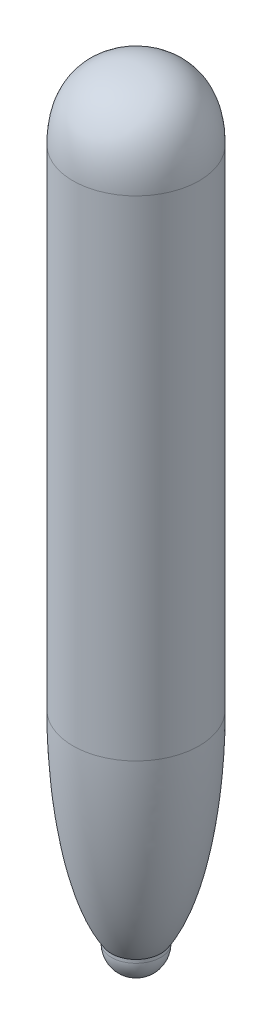
ISO-10303-21;
HEADER;
FILE_DESCRIPTION(('STEP AP214'),'2;1');
FILE_NAME('part.step','',(''),(''),'','','');
FILE_SCHEMA(('AUTOMOTIVE_DESIGN { 1 0 10303 214 1 1 1 1 }'));
ENDSEC;
DATA;
#1=APPLICATION_CONTEXT('core data for automotive mechanical design processes');
#2=APPLICATION_PROTOCOL_DEFINITION('international standard','automotive_design',2000,#1);
#3=PRODUCT_CONTEXT('',#1,'mechanical');
#4=PRODUCT('Part','Part','',(#3));
#5=PRODUCT_RELATED_PRODUCT_CATEGORY('part','',(#4));
#6=PRODUCT_DEFINITION_FORMATION('','',#4);
#7=PRODUCT_DEFINITION_CONTEXT('part definition',#1,'design');
#8=PRODUCT_DEFINITION('design','',#6,#7);
#9=PRODUCT_DEFINITION_SHAPE('','',#8);
#10=(LENGTH_UNIT() NAMED_UNIT(*) SI_UNIT(.MILLI.,.METRE.));
#11=(NAMED_UNIT(*) PLANE_ANGLE_UNIT() SI_UNIT($,.RADIAN.));
#12=(NAMED_UNIT(*) SI_UNIT($,.STERADIAN.) SOLID_ANGLE_UNIT());
#13=UNCERTAINTY_MEASURE_WITH_UNIT(LENGTH_MEASURE(1.E-05),#10,'distance_accuracy_value','');
#14=(GEOMETRIC_REPRESENTATION_CONTEXT(3) GLOBAL_UNCERTAINTY_ASSIGNED_CONTEXT((#13)) GLOBAL_UNIT_ASSIGNED_CONTEXT((#10,
#11,#12)) REPRESENTATION_CONTEXT('',''));
#15=CARTESIAN_POINT('',(0.,0.,0.));
#16=DIRECTION('',(0.,0.,1.));
#17=DIRECTION('',(1.,0.,0.));
#18=AXIS2_PLACEMENT_3D('',#15,#16,#17);
#19=CARTESIAN_POINT('',(0.,0.,0.));
#20=CARTESIAN_POINT('',(139.549394705016,33.9263469496858,0.));
#21=CARTESIAN_POINT('',(203.2,396.111416325188,0.));
#22=CARTESIAN_POINT('',(203.2,704.706637655799,0.));
#23=B_SPLINE_CURVE_WITH_KNOTS('',3,(#19,#20,#21,#22),.UNSPECIFIED.,.F.,.F.,(4,4),(0.,1.),.UNSPECIFIED.);
#24=CARTESIAN_POINT('',(0.,0.,0.));
#25=DIRECTION('',(0.,-1.,0.));
#26=AXIS1_PLACEMENT('',#24,#25);
#27=SURFACE_OF_REVOLUTION('',#23,#26);
#28=CARTESIAN_POINT('',(0.,704.706637655799,0.));
#29=DIRECTION('',(0.,-1.,0.));
#30=DIRECTION('',(0.,0.,-1.));
#31=AXIS2_PLACEMENT_3D('',#28,#29,#30);
#32=CIRCLE('',#31,203.2);
#33=CARTESIAN_POINT('',(0.,704.706637655799,-203.2));
#34=VERTEX_POINT('',#33);
#35=EDGE_CURVE('E58',#34,#34,#32,.T.);
#36=ORIENTED_EDGE('',*,*,#35,.T.);
#37=EDGE_LOOP('',(#36));
#38=FACE_BOUND('',#37,.T.);
#39=CARTESIAN_POINT('',(0.,63.84200074123,0.));
#40=DIRECTION('',(0.,-1.,0.));
#41=DIRECTION('',(0.,0.,-1.));
#42=AXIS2_PLACEMENT_3D('',#39,#40,#41);
#43=CIRCLE('',#42,79.7648455991294);
#44=CARTESIAN_POINT('',(0.,63.84200074123,-79.7648455991294));
#45=VERTEX_POINT('',#44);
#46=EDGE_CURVE('E53',#45,#45,#43,.F.);
#47=ORIENTED_EDGE('',*,*,#46,.T.);
#48=EDGE_LOOP('',(#47));
#49=FACE_BOUND('',#48,.T.);
#50=ADVANCED_FACE('F49',(#38,#49),#27,.F.);
#51=CARTESIAN_POINT('',(203.2,2280.69562717559,0.));
#52=CARTESIAN_POINT('',(203.2,2426.17399588945,0.));
#53=CARTESIAN_POINT('',(127.337237947954,2501.9,0.));
#54=CARTESIAN_POINT('',(0.,2501.9,0.));
#55=B_SPLINE_CURVE_WITH_KNOTS('',3,(#51,#52,#53,#54),.UNSPECIFIED.,.F.,.F.,(4,4),(0.,1.),.UNSPECIFIED.);
#56=CARTESIAN_POINT('',(0.,0.,0.));
#57=DIRECTION('',(0.,-1.,0.));
#58=AXIS1_PLACEMENT('',#56,#57);
#59=SURFACE_OF_REVOLUTION('',#55,#58);
#60=CARTESIAN_POINT('',(0.,2501.9,0.));
#61=VERTEX_POINT('',#60);
#62=VERTEX_LOOP('',#61);
#63=FACE_BOUND('',#62,.T.);
#64=CARTESIAN_POINT('',(0.,2280.69562717559,0.));
#65=DIRECTION('',(0.,-1.,0.));
#66=DIRECTION('',(0.,0.,-1.));
#67=AXIS2_PLACEMENT_3D('',#64,#65,#66);
#68=CIRCLE('',#67,203.2);
#69=CARTESIAN_POINT('',(0.,2280.69562717559,-203.2));
#70=VERTEX_POINT('',#69);
#71=EDGE_CURVE('E11',#70,#70,#68,.T.);
#72=ORIENTED_EDGE('',*,*,#71,.F.);
#73=EDGE_LOOP('',(#72));
#74=FACE_BOUND('',#73,.T.);
#75=ADVANCED_FACE('F61',(#63,#74),#59,.F.);
#76=CARTESIAN_POINT('',(0.,0.,0.));
#77=DIRECTION('',(0.,-1.,0.));
#78=DIRECTION('',(0.,0.,-1.));
#79=AXIS2_PLACEMENT_3D('',#76,#77,#78);
#80=CYLINDRICAL_SURFACE('',#79,203.2);
#81=ORIENTED_EDGE('',*,*,#71,.T.);
#82=EDGE_LOOP('',(#81));
#83=FACE_BOUND('',#82,.T.);
#84=ORIENTED_EDGE('',*,*,#35,.F.);
#85=EDGE_LOOP('',(#84));
#86=FACE_BOUND('',#85,.T.);
#87=ADVANCED_FACE('F64',(#83,#86),#80,.T.);
#88=CARTESIAN_POINT('',(0.,53.1719436019982,0.));
#89=DIRECTION('',(0.,1.,0.));
#90=DIRECTION('',(-1.,0.,0.));
#91=AXIS2_PLACEMENT_3D('',#88,#89,#90);
#92=CYLINDRICAL_SURFACE('',#91,79.7648455991294);
#93=ORIENTED_EDGE('',*,*,#46,.F.);
#94=EDGE_LOOP('',(#93));
#95=FACE_BOUND('',#94,.T.);
#96=CARTESIAN_POINT('',(0.,53.1719436019982,0.));
#97=DIRECTION('',(0.,1.,0.));
#98=DIRECTION('',(-1.,0.,0.));
#99=AXIS2_PLACEMENT_3D('',#96,#97,#98);
#100=CIRCLE('',#99,79.7648455991294);
#101=CARTESIAN_POINT('',(-79.7648455991294,53.1719436019982,0.));
#102=VERTEX_POINT('',#101);
#103=EDGE_CURVE('E78',#102,#102,#100,.T.);
#104=ORIENTED_EDGE('',*,*,#103,.T.);
#105=EDGE_LOOP('',(#104));
#106=FACE_BOUND('',#105,.T.);
#107=ADVANCED_FACE('F69',(#95,#106),#92,.T.);
#108=CARTESIAN_POINT('',(0.,53.1719436019982,0.));
#109=DIRECTION('',(0.,1.,0.));
#110=DIRECTION('',(1.,0.,0.));
#111=AXIS2_PLACEMENT_3D('',#108,#109,#110);
#112=SPHERICAL_SURFACE('',#111,79.7648455991294);
#113=ORIENTED_EDGE('',*,*,#103,.F.);
#114=EDGE_LOOP('',(#113));
#115=FACE_BOUND('',#114,.T.);
#116=ADVANCED_FACE('F93',(#115),#112,.T.);
#117=CLOSED_SHELL('',(#50,#75,#87,#107,#116));
#118=MANIFOLD_SOLID_BREP('B2',#117);
#119=ADVANCED_BREP_SHAPE_REPRESENTATION('',(#18,#118),#14);
#120=SHAPE_DEFINITION_REPRESENTATION(#9,#119);
ENDSEC;
END-ISO-10303-21;
